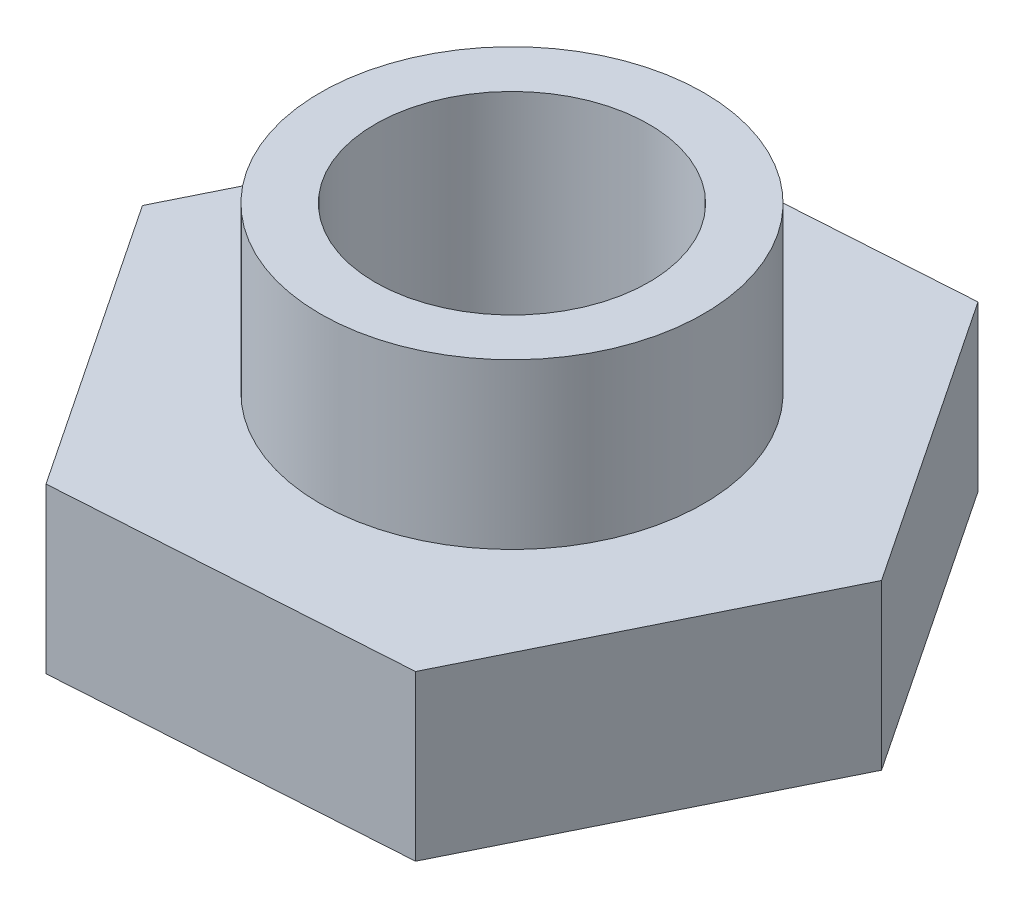
ISO-10303-21;
HEADER;
FILE_DESCRIPTION(('STEP AP214'),'2;1');
FILE_NAME('part.step','',(''),(''),'','','');
FILE_SCHEMA(('AUTOMOTIVE_DESIGN { 1 0 10303 214 1 1 1 1 }'));
ENDSEC;
DATA;
#1=APPLICATION_CONTEXT('core data for automotive mechanical design processes');
#2=APPLICATION_PROTOCOL_DEFINITION('international standard','automotive_design',2000,#1);
#3=PRODUCT_CONTEXT('',#1,'mechanical');
#4=PRODUCT('Part','Part','',(#3));
#5=PRODUCT_RELATED_PRODUCT_CATEGORY('part','',(#4));
#6=PRODUCT_DEFINITION_FORMATION('','',#4);
#7=PRODUCT_DEFINITION_CONTEXT('part definition',#1,'design');
#8=PRODUCT_DEFINITION('design','',#6,#7);
#9=PRODUCT_DEFINITION_SHAPE('','',#8);
#10=(LENGTH_UNIT() NAMED_UNIT(*) SI_UNIT(.MILLI.,.METRE.));
#11=(NAMED_UNIT(*) PLANE_ANGLE_UNIT() SI_UNIT($,.RADIAN.));
#12=(NAMED_UNIT(*) SI_UNIT($,.STERADIAN.) SOLID_ANGLE_UNIT());
#13=UNCERTAINTY_MEASURE_WITH_UNIT(LENGTH_MEASURE(1.E-05),#10,'distance_accuracy_value','');
#14=(GEOMETRIC_REPRESENTATION_CONTEXT(3) GLOBAL_UNCERTAINTY_ASSIGNED_CONTEXT((#13)) GLOBAL_UNIT_ASSIGNED_CONTEXT((#10,
#11,#12)) REPRESENTATION_CONTEXT('',''));
#15=CARTESIAN_POINT('',(0.,0.,0.));
#16=DIRECTION('',(0.,0.,1.));
#17=DIRECTION('',(1.,0.,0.));
#18=AXIS2_PLACEMENT_3D('',#15,#16,#17);
#19=CARTESIAN_POINT('',(36.8577939001171,-65.6905754637423,10.4000283791901));
#20=DIRECTION('',(0.,-1.,0.));
#21=DIRECTION('',(0.,0.,-1.));
#22=AXIS2_PLACEMENT_3D('',#19,#20,#21);
#23=CYLINDRICAL_SURFACE('',#22,3.5);
#24=CARTESIAN_POINT('',(36.8577939001171,-65.6905754637423,10.4000283791901));
#25=DIRECTION('',(0.,-1.,0.));
#26=DIRECTION('',(0.,0.,-1.));
#27=AXIS2_PLACEMENT_3D('',#24,#25,#26);
#28=CIRCLE('',#27,3.5);
#29=CARTESIAN_POINT('',(36.8577939001171,-65.6905754637423,6.90002837919011));
#30=VERTEX_POINT('',#29);
#31=EDGE_CURVE('E19',#30,#30,#28,.F.);
#32=ORIENTED_EDGE('',*,*,#31,.F.);
#33=EDGE_LOOP('',(#32));
#34=FACE_BOUND('',#33,.T.);
#35=CARTESIAN_POINT('',(36.8577939001171,-68.6905754637423,10.4000283791901));
#36=DIRECTION('',(0.,-1.,0.));
#37=DIRECTION('',(0.,0.,-1.));
#38=AXIS2_PLACEMENT_3D('',#35,#36,#37);
#39=CIRCLE('',#38,3.5);
#40=CARTESIAN_POINT('',(36.8577939001171,-68.6905754637423,6.90002837919011));
#41=VERTEX_POINT('',#40);
#42=EDGE_CURVE('E97',#41,#41,#39,.T.);
#43=ORIENTED_EDGE('',*,*,#42,.F.);
#44=EDGE_LOOP('',(#43));
#45=FACE_BOUND('',#44,.T.);
#46=ADVANCED_FACE('F16',(#34,#45),#23,.T.);
#47=CARTESIAN_POINT('',(36.8577939001171,-65.6905754637423,10.4000283791901));
#48=DIRECTION('',(0.,1.,0.));
#49=DIRECTION('',(0.,0.,1.));
#50=AXIS2_PLACEMENT_3D('',#47,#48,#49);
#51=PLANE('',#50);
#52=ORIENTED_EDGE('',*,*,#31,.T.);
#53=EDGE_LOOP('',(#52));
#54=FACE_BOUND('',#53,.T.);
#55=CARTESIAN_POINT('',(36.8577939001171,-65.6905754637423,10.4000283791901));
#56=DIRECTION('',(0.,1.,0.));
#57=DIRECTION('',(0.,0.,1.));
#58=AXIS2_PLACEMENT_3D('',#55,#56,#57);
#59=CIRCLE('',#58,2.5);
#60=CARTESIAN_POINT('',(36.8577939001171,-65.6905754637423,12.9000283791901));
#61=VERTEX_POINT('',#60);
#62=EDGE_CURVE('E77',#61,#61,#59,.F.);
#63=ORIENTED_EDGE('',*,*,#62,.T.);
#64=EDGE_LOOP('',(#63));
#65=FACE_BOUND('',#64,.T.);
#66=ADVANCED_FACE('F104',(#54,#65),#51,.T.);
#67=CARTESIAN_POINT('',(34.0435022209215,-68.6905754637423,16.0932783893112));
#68=DIRECTION('',(0.,1.,0.));
#69=DIRECTION('',(0.,0.,1.));
#70=AXIS2_PLACEMENT_3D('',#67,#68,#69);
#71=PLANE('',#70);
#72=ORIENTED_EDGE('',*,*,#42,.T.);
#73=EDGE_LOOP('',(#72));
#74=FACE_BOUND('',#73,.T.);
#75=DIRECTION('',(0.997920282093107,0.,-0.0644601472788657));
#76=VECTOR('',#75,1.);
#77=CARTESIAN_POINT('',(39.6720855793127,-68.6905754637423,4.70677836906899));
#78=LINE('',#77,#76);
#79=CARTESIAN_POINT('',(39.6720855793127,-68.6905754637423,4.70677836906899));
#80=VERTEX_POINT('',#79);
#81=CARTESIAN_POINT('',(33.3344406008539,-68.6905754637423,5.11615528628701));
#82=VERTEX_POINT('',#81);
#83=EDGE_CURVE('E262',#80,#82,#78,.F.);
#84=ORIENTED_EDGE('',*,*,#83,.T.);
#85=DIRECTION('',(0.443136015971369,0.,-0.896454388883797));
#86=VECTOR('',#85,1.);
#87=CARTESIAN_POINT('',(33.3344406008539,-68.6905754637423,5.11615528628701));
#88=LINE('',#87,#86);
#89=CARTESIAN_POINT('',(30.5201489216584,-68.6905754637423,10.8094052964081));
#90=VERTEX_POINT('',#89);
#91=EDGE_CURVE('E270',#82,#90,#88,.F.);
#92=ORIENTED_EDGE('',*,*,#91,.T.);
#93=DIRECTION('',(-0.55478426612174,0.,-0.83199424160493));
#94=VECTOR('',#93,1.);
#95=CARTESIAN_POINT('',(30.5201489216584,-68.6905754637423,10.8094052964081));
#96=LINE('',#95,#94);
#97=CARTESIAN_POINT('',(34.0435022209215,-68.6905754637423,16.0932783893112));
#98=VERTEX_POINT('',#97);
#99=EDGE_CURVE('E71',#90,#98,#96,.F.);
#100=ORIENTED_EDGE('',*,*,#99,.T.);
#101=DIRECTION('',(-0.997920282093107,0.,0.0644601472788676));
#102=VECTOR('',#101,1.);
#103=CARTESIAN_POINT('',(34.0435022209215,-68.6905754637423,16.0932783893112));
#104=LINE('',#103,#102);
#105=CARTESIAN_POINT('',(40.3811471993802,-68.6905754637423,15.6839014720932));
#106=VERTEX_POINT('',#105);
#107=EDGE_CURVE('E69',#98,#106,#104,.F.);
#108=ORIENTED_EDGE('',*,*,#107,.T.);
#109=DIRECTION('',(-0.443136015971369,0.,0.896454388883798));
#110=VECTOR('',#109,1.);
#111=CARTESIAN_POINT('',(40.3811471993802,-68.6905754637423,15.6839014720932));
#112=LINE('',#111,#110);
#113=CARTESIAN_POINT('',(43.1954388785758,-68.6905754637423,9.99065146197209));
#114=VERTEX_POINT('',#113);
#115=EDGE_CURVE('E66',#106,#114,#112,.F.);
#116=ORIENTED_EDGE('',*,*,#115,.T.);
#117=DIRECTION('',(0.554784266121739,0.,0.831994241604931));
#118=VECTOR('',#117,1.);
#119=CARTESIAN_POINT('',(43.1954388785758,-68.6905754637423,9.99065146197209));
#120=LINE('',#119,#118);
#121=EDGE_CURVE('E256',#114,#80,#120,.F.);
#122=ORIENTED_EDGE('',*,*,#121,.T.);
#123=EDGE_LOOP('',(#84,#92,#100,#108,#116,#122));
#124=FACE_BOUND('',#123,.T.);
#125=ADVANCED_FACE('F70',(#74,#124),#71,.T.);
#126=CARTESIAN_POINT('',(36.8577939001171,-65.6905754637423,10.4000283791901));
#127=DIRECTION('',(0.,1.,0.));
#128=DIRECTION('',(0.,0.,1.));
#129=AXIS2_PLACEMENT_3D('',#126,#127,#128);
#130=CYLINDRICAL_SURFACE('',#129,2.5);
#131=ORIENTED_EDGE('',*,*,#62,.F.);
#132=EDGE_LOOP('',(#131));
#133=FACE_BOUND('',#132,.T.);
#134=CARTESIAN_POINT('',(36.8577939001171,-71.6905754637423,10.4000283791901));
#135=DIRECTION('',(0.,1.,0.));
#136=DIRECTION('',(0.,0.,1.));
#137=AXIS2_PLACEMENT_3D('',#134,#135,#136);
#138=CIRCLE('',#137,2.5);
#139=CARTESIAN_POINT('',(36.8577939001171,-71.6905754637423,12.9000283791901));
#140=VERTEX_POINT('',#139);
#141=EDGE_CURVE('E92',#140,#140,#138,.F.);
#142=ORIENTED_EDGE('',*,*,#141,.T.);
#143=EDGE_LOOP('',(#142));
#144=FACE_BOUND('',#143,.T.);
#145=ADVANCED_FACE('F141',(#133,#144),#130,.F.);
#146=CARTESIAN_POINT('',(34.0435022209215,-68.6905754637423,16.0932783893112));
#147=DIRECTION('',(-0.0644601472788676,0.,-0.997920282093107));
#148=DIRECTION('',(-0.997920282093107,0.,0.0644601472788676));
#149=AXIS2_PLACEMENT_3D('',#146,#147,#148);
#150=PLANE('',#149);
#151=DIRECTION('',(0.,1.,0.));
#152=VECTOR('',#151,1.);
#153=CARTESIAN_POINT('',(40.3811471993802,-68.6905754637423,15.6839014720932));
#154=LINE('',#153,#152);
#155=CARTESIAN_POINT('',(40.3811471993802,-71.6905754637423,15.6839014720932));
#156=VERTEX_POINT('',#155);
#157=EDGE_CURVE('E76',#156,#106,#154,.T.);
#158=ORIENTED_EDGE('',*,*,#157,.T.);
#159=ORIENTED_EDGE('',*,*,#107,.F.);
#160=DIRECTION('',(0.,1.,0.));
#161=VECTOR('',#160,1.);
#162=CARTESIAN_POINT('',(34.0435022209215,-68.6905754637423,16.0932783893112));
#163=LINE('',#162,#161);
#164=CARTESIAN_POINT('',(34.0435022209215,-71.6905754637423,16.0932783893112));
#165=VERTEX_POINT('',#164);
#166=EDGE_CURVE('E95',#98,#165,#163,.F.);
#167=ORIENTED_EDGE('',*,*,#166,.T.);
#168=DIRECTION('',(0.997920282093107,0.,-0.0644601472788679));
#169=VECTOR('',#168,1.);
#170=CARTESIAN_POINT('',(34.0435022209215,-71.6905754637423,16.0932783893112));
#171=LINE('',#170,#169);
#172=EDGE_CURVE('E88',#165,#156,#171,.T.);
#173=ORIENTED_EDGE('',*,*,#172,.T.);
#174=EDGE_LOOP('',(#158,#159,#167,#173));
#175=FACE_BOUND('',#174,.T.);
#176=ADVANCED_FACE('F87',(#175),#150,.F.);
#177=CARTESIAN_POINT('',(40.3811471993802,-68.6905754637423,15.6839014720932));
#178=DIRECTION('',(-0.896454388883798,0.,-0.443136015971369));
#179=DIRECTION('',(-0.443136015971369,0.,0.896454388883798));
#180=AXIS2_PLACEMENT_3D('',#177,#178,#179);
#181=PLANE('',#180);
#182=DIRECTION('',(0.,1.,0.));
#183=VECTOR('',#182,1.);
#184=CARTESIAN_POINT('',(43.1954388785758,-68.6905754637423,9.99065146197209));
#185=LINE('',#184,#183);
#186=CARTESIAN_POINT('',(43.1954388785758,-71.6905754637423,9.99065146197209));
#187=VERTEX_POINT('',#186);
#188=EDGE_CURVE('E84',#187,#114,#185,.T.);
#189=ORIENTED_EDGE('',*,*,#188,.T.);
#190=ORIENTED_EDGE('',*,*,#115,.F.);
#191=ORIENTED_EDGE('',*,*,#157,.F.);
#192=DIRECTION('',(0.443136015971368,0.,-0.896454388883798));
#193=VECTOR('',#192,1.);
#194=CARTESIAN_POINT('',(40.3811471993802,-71.6905754637423,15.6839014720932));
#195=LINE('',#194,#193);
#196=EDGE_CURVE('E276',#156,#187,#195,.T.);
#197=ORIENTED_EDGE('',*,*,#196,.T.);
#198=EDGE_LOOP('',(#189,#190,#191,#197));
#199=FACE_BOUND('',#198,.T.);
#200=ADVANCED_FACE('F81',(#199),#181,.F.);
#201=CARTESIAN_POINT('',(43.1954388785758,-68.6905754637423,9.99065146197209));
#202=DIRECTION('',(-0.831994241604931,0.,0.554784266121739));
#203=DIRECTION('',(0.554784266121739,0.,0.831994241604931));
#204=AXIS2_PLACEMENT_3D('',#201,#202,#203);
#205=PLANE('',#204);
#206=DIRECTION('',(0.,1.,0.));
#207=VECTOR('',#206,1.);
#208=CARTESIAN_POINT('',(39.6720855793127,-68.6905754637423,4.70677836906899));
#209=LINE('',#208,#207);
#210=CARTESIAN_POINT('',(39.6720855793127,-71.6905754637423,4.70677836906899));
#211=VERTEX_POINT('',#210);
#212=EDGE_CURVE('E255',#211,#80,#209,.T.);
#213=ORIENTED_EDGE('',*,*,#212,.T.);
#214=ORIENTED_EDGE('',*,*,#121,.F.);
#215=ORIENTED_EDGE('',*,*,#188,.F.);
#216=DIRECTION('',(-0.554784266121739,0.,-0.831994241604931));
#217=VECTOR('',#216,1.);
#218=CARTESIAN_POINT('',(43.1954388785758,-71.6905754637423,9.99065146197209));
#219=LINE('',#218,#217);
#220=EDGE_CURVE('E258',#187,#211,#219,.T.);
#221=ORIENTED_EDGE('',*,*,#220,.T.);
#222=EDGE_LOOP('',(#213,#214,#215,#221));
#223=FACE_BOUND('',#222,.T.);
#224=ADVANCED_FACE('F132',(#223),#205,.F.);
#225=CARTESIAN_POINT('',(39.6720855793127,-68.6905754637423,4.70677836906899));
#226=DIRECTION('',(0.0644601472788657,0.,0.997920282093107));
#227=DIRECTION('',(0.997920282093107,0.,-0.0644601472788657));
#228=AXIS2_PLACEMENT_3D('',#225,#226,#227);
#229=PLANE('',#228);
#230=DIRECTION('',(0.,1.,0.));
#231=VECTOR('',#230,1.);
#232=CARTESIAN_POINT('',(33.3344406008539,-68.6905754637423,5.11615528628701));
#233=LINE('',#232,#231);
#234=CARTESIAN_POINT('',(33.3344406008539,-71.6905754637423,5.11615528628701));
#235=VERTEX_POINT('',#234);
#236=EDGE_CURVE('E264',#235,#82,#233,.T.);
#237=ORIENTED_EDGE('',*,*,#236,.T.);
#238=ORIENTED_EDGE('',*,*,#83,.F.);
#239=ORIENTED_EDGE('',*,*,#212,.F.);
#240=DIRECTION('',(-0.997920282093107,0.,0.0644601472788659));
#241=VECTOR('',#240,1.);
#242=CARTESIAN_POINT('',(39.6720855793127,-71.6905754637423,4.70677836906899));
#243=LINE('',#242,#241);
#244=EDGE_CURVE('E279',#211,#235,#243,.T.);
#245=ORIENTED_EDGE('',*,*,#244,.T.);
#246=EDGE_LOOP('',(#237,#238,#239,#245));
#247=FACE_BOUND('',#246,.T.);
#248=ADVANCED_FACE('F128',(#247),#229,.F.);
#249=CARTESIAN_POINT('',(33.3344406008539,-68.6905754637423,5.11615528628701));
#250=DIRECTION('',(0.896454388883797,0.,0.443136015971369));
#251=DIRECTION('',(0.443136015971369,0.,-0.896454388883797));
#252=AXIS2_PLACEMENT_3D('',#249,#250,#251);
#253=PLANE('',#252);
#254=DIRECTION('',(0.,1.,0.));
#255=VECTOR('',#254,1.);
#256=CARTESIAN_POINT('',(30.5201489216584,-68.6905754637423,10.8094052964081));
#257=LINE('',#256,#255);
#258=CARTESIAN_POINT('',(30.5201489216584,-71.6905754637423,10.8094052964081));
#259=VERTEX_POINT('',#258);
#260=EDGE_CURVE('E33',#259,#90,#257,.T.);
#261=ORIENTED_EDGE('',*,*,#260,.T.);
#262=ORIENTED_EDGE('',*,*,#91,.F.);
#263=ORIENTED_EDGE('',*,*,#236,.F.);
#264=DIRECTION('',(-0.443136015971369,0.,0.896454388883797));
#265=VECTOR('',#264,1.);
#266=CARTESIAN_POINT('',(33.3344406008539,-71.6905754637423,5.11615528628701));
#267=LINE('',#266,#265);
#268=EDGE_CURVE('E25',#235,#259,#267,.T.);
#269=ORIENTED_EDGE('',*,*,#268,.T.);
#270=EDGE_LOOP('',(#261,#262,#263,#269));
#271=FACE_BOUND('',#270,.T.);
#272=ADVANCED_FACE('F121',(#271),#253,.F.);
#273=CARTESIAN_POINT('',(30.5201489216584,-68.6905754637423,10.8094052964081));
#274=DIRECTION('',(0.83199424160493,0.,-0.55478426612174));
#275=DIRECTION('',(-0.55478426612174,0.,-0.83199424160493));
#276=AXIS2_PLACEMENT_3D('',#273,#274,#275);
#277=PLANE('',#276);
#278=ORIENTED_EDGE('',*,*,#166,.F.);
#279=ORIENTED_EDGE('',*,*,#99,.F.);
#280=ORIENTED_EDGE('',*,*,#260,.F.);
#281=DIRECTION('',(0.55478426612174,0.,0.83199424160493));
#282=VECTOR('',#281,1.);
#283=CARTESIAN_POINT('',(30.5201489216584,-71.6905754637423,10.8094052964081));
#284=LINE('',#283,#282);
#285=EDGE_CURVE('E11',#259,#165,#284,.T.);
#286=ORIENTED_EDGE('',*,*,#285,.T.);
#287=EDGE_LOOP('',(#278,#279,#280,#286));
#288=FACE_BOUND('',#287,.T.);
#289=ADVANCED_FACE('F115',(#288),#277,.F.);
#290=CARTESIAN_POINT('',(34.0435022209215,-71.6905754637423,16.0932783893112));
#291=DIRECTION('',(0.,1.,0.));
#292=DIRECTION('',(0.,0.,1.));
#293=AXIS2_PLACEMENT_3D('',#290,#291,#292);
#294=PLANE('',#293);
#295=ORIENTED_EDGE('',*,*,#268,.F.);
#296=ORIENTED_EDGE('',*,*,#244,.F.);
#297=ORIENTED_EDGE('',*,*,#220,.F.);
#298=ORIENTED_EDGE('',*,*,#196,.F.);
#299=ORIENTED_EDGE('',*,*,#172,.F.);
#300=ORIENTED_EDGE('',*,*,#285,.F.);
#301=EDGE_LOOP('',(#295,#296,#297,#298,#299,#300));
#302=FACE_BOUND('',#301,.T.);
#303=ORIENTED_EDGE('',*,*,#141,.F.);
#304=EDGE_LOOP('',(#303));
#305=FACE_BOUND('',#304,.T.);
#306=ADVANCED_FACE('F113',(#302,#305),#294,.F.);
#307=CLOSED_SHELL('',(#46,#66,#125,#145,#176,#200,#224,#248,#272,#289,#306));
#308=MANIFOLD_SOLID_BREP('B1',#307);
#309=ADVANCED_BREP_SHAPE_REPRESENTATION('',(#18,#308),#14);
#310=SHAPE_DEFINITION_REPRESENTATION(#9,#309);
ENDSEC;
END-ISO-10303-21;
